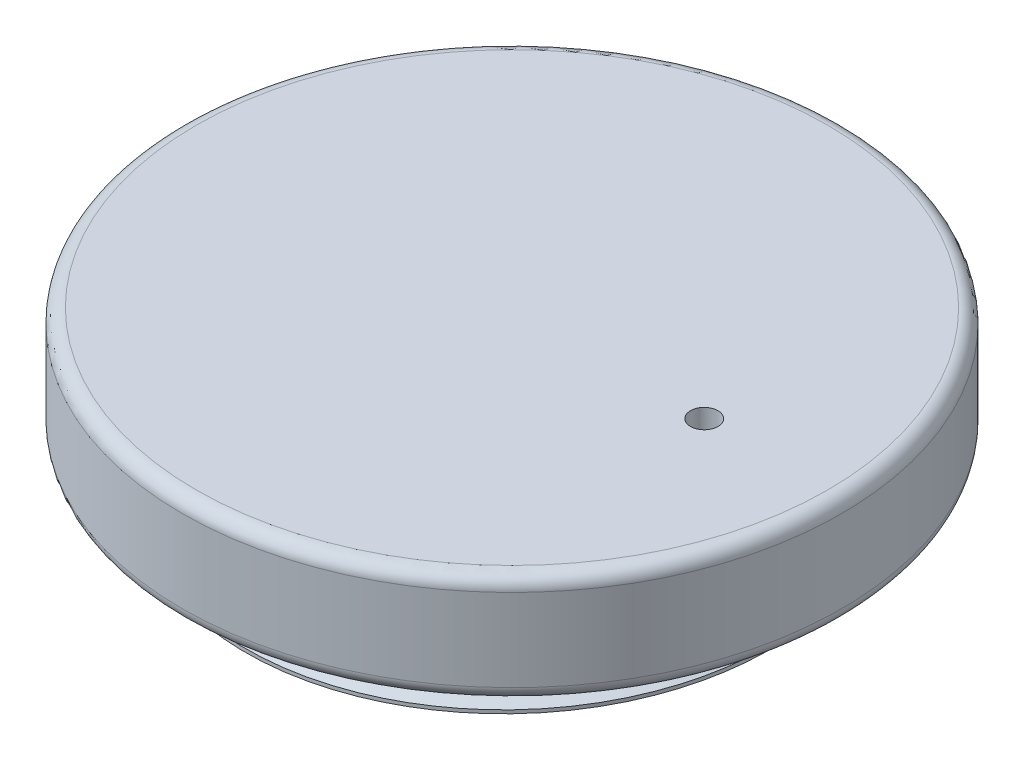
ISO-10303-21;
HEADER;
FILE_DESCRIPTION(('STEP AP214'),'2;1');
FILE_NAME('part.step','',(''),(''),'','','');
FILE_SCHEMA(('AUTOMOTIVE_DESIGN { 1 0 10303 214 1 1 1 1 }'));
ENDSEC;
DATA;
#1=APPLICATION_CONTEXT('core data for automotive mechanical design processes');
#2=APPLICATION_PROTOCOL_DEFINITION('international standard','automotive_design',2000,#1);
#3=PRODUCT_CONTEXT('',#1,'mechanical');
#4=PRODUCT('Part','Part','',(#3));
#5=PRODUCT_RELATED_PRODUCT_CATEGORY('part','',(#4));
#6=PRODUCT_DEFINITION_FORMATION('','',#4);
#7=PRODUCT_DEFINITION_CONTEXT('part definition',#1,'design');
#8=PRODUCT_DEFINITION('design','',#6,#7);
#9=PRODUCT_DEFINITION_SHAPE('','',#8);
#10=(LENGTH_UNIT() NAMED_UNIT(*) SI_UNIT(.MILLI.,.METRE.));
#11=(NAMED_UNIT(*) PLANE_ANGLE_UNIT() SI_UNIT($,.RADIAN.));
#12=(NAMED_UNIT(*) SI_UNIT($,.STERADIAN.) SOLID_ANGLE_UNIT());
#13=UNCERTAINTY_MEASURE_WITH_UNIT(LENGTH_MEASURE(1.E-05),#10,'distance_accuracy_value','');
#14=(GEOMETRIC_REPRESENTATION_CONTEXT(3) GLOBAL_UNCERTAINTY_ASSIGNED_CONTEXT((#13)) GLOBAL_UNIT_ASSIGNED_CONTEXT((#10,
#11,#12)) REPRESENTATION_CONTEXT('',''));
#15=CARTESIAN_POINT('',(0.,0.,0.));
#16=DIRECTION('',(0.,0.,1.));
#17=DIRECTION('',(1.,0.,0.));
#18=AXIS2_PLACEMENT_3D('',#15,#16,#17);
#19=CARTESIAN_POINT('',(0.,2.,0.));
#20=DIRECTION('',(0.,-1.,0.));
#21=DIRECTION('',(0.,0.,-1.));
#22=AXIS2_PLACEMENT_3D('',#19,#20,#21);
#23=CYLINDRICAL_SURFACE('',#22,9.);
#24=DIRECTION('',(0.,1.,0.));
#25=VECTOR('',#24,1.);
#26=CARTESIAN_POINT('',(-9.00000000000016,1.62500000136562,0.));
#27=LINE('',#26,#25);
#28=CARTESIAN_POINT('',(-9.00000000000016,1.25000000273118,0.));
#29=VERTEX_POINT('',#28);
#30=CARTESIAN_POINT('',(-9.00000000000016,2.00000000000006,0.));
#31=VERTEX_POINT('',#30);
#32=EDGE_CURVE('E56',#29,#31,#27,.T.);
#33=ORIENTED_EDGE('',*,*,#32,.F.);
#34=CARTESIAN_POINT('',(-9.00000000000016,1.25000000273118,0.));
#35=CARTESIAN_POINT('',(-8.99999999999968,1.18750000273121,-3.72792206135827));
#36=CARTESIAN_POINT('',(-6.36396103067892,1.12500000273125,-6.36396103067927));
#37=CARTESIAN_POINT('',(-3.72792206135761,1.06250000273119,-9.00000000000068));
#38=CARTESIAN_POINT('',(0.,1.00000000273132,-9.00000000000045));
#39=CARTESIAN_POINT('',(3.72792206135812,0.937500002731278,-8.99999999999969));
#40=CARTESIAN_POINT('',(6.36396103067889,0.875000002731108,-6.36396103067904));
#41=CARTESIAN_POINT('',(9.00000000000041,0.81250000273131,-3.72792206135881));
#42=CARTESIAN_POINT('',(8.9999999999997,0.750000002731177,-4.9960036108132E-13));
#43=CARTESIAN_POINT('',(9.00000000000014,0.687500002731282,3.72792206135791));
#44=CARTESIAN_POINT('',(6.36396103067896,0.625000002731246,6.36396103067838));
#45=CARTESIAN_POINT('',(3.72792206135795,0.562500002731133,8.99999999999981));
#46=CARTESIAN_POINT('',(0.,0.500000002731094,9.00000000000006));
#47=CARTESIAN_POINT('',(-3.72792206135755,0.437500002731105,9.00000000000035));
#48=CARTESIAN_POINT('',(-6.3639610306792,0.375000002731218,6.36396103067888));
#49=CARTESIAN_POINT('',(-8.99999999999962,0.312500002731137,3.72792206135725));
#50=CARTESIAN_POINT('',(-9.00000000000012,0.250000002731288,0.));
#51=CARTESIAN_POINT('',(-8.99999999999998,0.187500002731229,-3.72792206135803));
#52=CARTESIAN_POINT('',(-6.36396103067892,0.125000002731135,-6.36396103067927));
#53=CARTESIAN_POINT('',(-3.72792206135761,0.0625000027312004,-9.00000000000068));
#54=CARTESIAN_POINT('',(1.38777878078145E-13,2.73120415172912E-09,-9.00000000000034));
#55=CARTESIAN_POINT('',(3.72792206135798,-0.0624999972687076,-8.99999999999966));
#56=CARTESIAN_POINT('',(6.36396103067889,-0.124999997268782,-6.36396103067904));
#57=CARTESIAN_POINT('',(9.00000000000025,-0.187499997268676,-3.72792206135875));
#58=CARTESIAN_POINT('',(8.9999999999997,-0.249999997268713,-4.9960036108132E-13));
#59=CARTESIAN_POINT('',(9.00000000000014,-0.312499997268704,3.72792206135791));
#60=CARTESIAN_POINT('',(6.36396103067896,-0.374999997268866,6.36396103067838));
#61=CARTESIAN_POINT('',(3.72792206135795,-0.437499997268853,8.99999999999981));
#62=CARTESIAN_POINT('',(0.,-0.499999997268796,9.00000000000006));
#63=CARTESIAN_POINT('',(-3.7279220613575,-0.562499997268881,9.00000000000035));
#64=CARTESIAN_POINT('',(-6.36396103067913,-0.624999997268672,6.36396103067893));
#65=CARTESIAN_POINT('',(-8.99999999999959,-0.687499997268849,3.72792206135725));
#66=CARTESIAN_POINT('',(-9.00000000000009,-0.749999997268824,0.));
#67=(BOUNDED_CURVE() B_SPLINE_CURVE(2,(#34,#35,#36,#37,#38,#39,#40,#41,#42,#43,#44,#45,#46,#47,
#48,#49,#50,#51,#52,#53,#54,#55,#56,#57,#58,#59,#60,#61,#62,#63,#64,#65,#66),.UNSPECIFIED.,.F.,
.F.) B_SPLINE_CURVE_WITH_KNOTS((3,2,2,2,2,2,2,2,2,2,2,2,2,2,2,2,3),(0.,0.0625,0.125,0.1875,0.25,
0.3125,0.375,0.4375,0.5,0.5625,0.625,0.6875,0.75,0.8125,0.875,0.9375,1.),
.UNSPECIFIED.) CURVE() GEOMETRIC_REPRESENTATION_ITEM() RATIONAL_B_SPLINE_CURVE((1.,
0.923879532511287,1.,0.923879532511287,1.,0.923879532511287,1.,0.923879532511287,1.,
0.923879532511287,1.,0.923879532511287,1.,0.923879532511287,1.,0.923879532511287,1.,
0.923879532511287,1.,0.923879532511287,1.,0.923879532511287,1.,0.923879532511287,1.,
0.923879532511287,1.,0.923879532511287,1.,0.923879532511287,1.,0.923879532511287,1.)) REPRESENTATION_ITEM(''));
#68=CARTESIAN_POINT('',(1.62906341194535E-07,0.,-9.00000000000017));
#69=VERTEX_POINT('',#68);
#70=EDGE_CURVE('E61',#29,#69,#67,.T.);
#71=ORIENTED_EDGE('',*,*,#70,.T.);
#72=CARTESIAN_POINT('',(0.,0.,0.));
#73=DIRECTION('',(0.,1.,0.));
#74=DIRECTION('',(0.,0.,1.));
#75=AXIS2_PLACEMENT_3D('',#72,#73,#74);
#76=CIRCLE('',#75,9.);
#77=CARTESIAN_POINT('',(-9.00000000000012,0.,0.));
#78=VERTEX_POINT('',#77);
#79=EDGE_CURVE('E125',#69,#78,#76,.T.);
#80=ORIENTED_EDGE('',*,*,#79,.T.);
#81=CARTESIAN_POINT('',(-9.00000000000016,2.00000000000006,0.));
#82=CARTESIAN_POINT('',(-8.99999999999968,1.93750000000005,-3.72792206135827));
#83=CARTESIAN_POINT('',(-6.36396103067892,1.87500000000013,-6.36396103067927));
#84=CARTESIAN_POINT('',(-3.72792206135761,1.81250000000002,-9.00000000000068));
#85=CARTESIAN_POINT('',(0.,1.74999999999997,-9.00000000000045));
#86=CARTESIAN_POINT('',(3.72792206135797,1.68750000000011,-8.99999999999969));
#87=CARTESIAN_POINT('',(6.36396103067889,1.62499999999999,-6.36396103067904));
#88=CARTESIAN_POINT('',(9.00000000000041,1.56250000000014,-3.72792206135881));
#89=CARTESIAN_POINT('',(8.9999999999997,1.50000000000006,-4.9960036108132E-13));
#90=CARTESIAN_POINT('',(9.00000000000014,1.43750000000011,3.72792206135797));
#91=CARTESIAN_POINT('',(6.36396103067892,1.3749999999999,6.36396103067838));
#92=CARTESIAN_POINT('',(3.72792206135839,1.31249999999997,8.99999999999963));
#93=CARTESIAN_POINT('',(0.,1.24999999999997,9.00000000000006));
#94=CARTESIAN_POINT('',(-3.72792206135755,1.18749999999994,9.00000000000035));
#95=CARTESIAN_POINT('',(-6.3639610306792,1.1250000000001,6.36396103067888));
#96=CARTESIAN_POINT('',(-8.99999999999959,1.06249999999997,3.72792206135725));
#97=CARTESIAN_POINT('',(-9.00000000000016,0.999999999999945,0.));
#98=CARTESIAN_POINT('',(-8.99999999999968,0.937500000000062,-3.72792206135827));
#99=CARTESIAN_POINT('',(-6.36396103067892,0.875000000000015,-6.36396103067927));
#100=CARTESIAN_POINT('',(-3.72792206135761,0.812500000000034,-9.00000000000068));
#101=CARTESIAN_POINT('',(0.,0.750000000000084,-9.00000000000045));
#102=CARTESIAN_POINT('',(3.72792206135786,0.687500000000125,-8.99999999999972));
#103=CARTESIAN_POINT('',(6.36396103067889,0.625000000000098,-6.36396103067904));
#104=CARTESIAN_POINT('',(9.00000000000025,0.562500000000157,-3.72792206135875));
#105=CARTESIAN_POINT('',(8.9999999999997,0.499999999999945,-4.9960036108132E-13));
#106=CARTESIAN_POINT('',(9.00000000000014,0.437499999999889,3.72792206135791));
#107=CARTESIAN_POINT('',(6.36396103067896,0.375000000000014,6.36396103067838));
#108=CARTESIAN_POINT('',(3.72792206135795,0.312499999999981,8.99999999999981));
#109=CARTESIAN_POINT('',(0.,0.250000000000083,9.00000000000006));
#110=CARTESIAN_POINT('',(-3.72792206135755,0.187499999999952,9.00000000000035));
#111=CARTESIAN_POINT('',(-6.3639610306792,0.124999999999986,6.36396103067888));
#112=CARTESIAN_POINT('',(-8.99999999999959,0.0624999999999841,3.72792206135725));
#113=CARTESIAN_POINT('',(-9.00000000000012,0.,0.));
#114=(BOUNDED_CURVE() B_SPLINE_CURVE(2,(#81,#82,#83,#84,#85,#86,#87,#88,#89,#90,#91,#92,#93,#94,
#95,#96,#97,#98,#99,#100,#101,#102,#103,#104,#105,#106,#107,#108,#109,#110,#111,#112,#113),
.UNSPECIFIED.,.F.,.F.) B_SPLINE_CURVE_WITH_KNOTS((3,2,2,2,2,2,2,2,2,2,2,2,2,2,2,2,3),(0.,0.0625,
0.125,0.1875,0.25,0.3125,0.375,0.4375,0.5,0.5625,0.625,0.6875,0.75,0.8125,0.875,0.9375,1.),
.UNSPECIFIED.) CURVE() GEOMETRIC_REPRESENTATION_ITEM() RATIONAL_B_SPLINE_CURVE((1.,
0.923879532511287,1.,0.923879532511287,1.,0.923879532511287,1.,0.923879532511287,1.,
0.923879532511287,1.,0.923879532511287,1.,0.923879532511287,1.,0.923879532511287,1.,
0.923879532511287,1.,0.923879532511287,1.,0.923879532511287,1.,0.923879532511287,1.,
0.923879532511287,1.,0.923879532511287,1.,0.923879532511287,1.,0.923879532511287,1.)) REPRESENTATION_ITEM(''));
#115=EDGE_CURVE('E110',#31,#78,#114,.T.);
#116=ORIENTED_EDGE('',*,*,#115,.F.);
#117=CARTESIAN_POINT('',(0.,2.,0.));
#118=DIRECTION('',(0.,1.,0.));
#119=DIRECTION('',(0.,0.,1.));
#120=AXIS2_PLACEMENT_3D('',#117,#118,#119);
#121=CIRCLE('',#120,9.);
#122=EDGE_CURVE('E121',#31,#31,#121,.T.);
#123=ORIENTED_EDGE('',*,*,#122,.F.);
#124=EDGE_LOOP('',(#33,#71,#80,#116,#123));
#125=FACE_BOUND('',#124,.T.);
#126=ADVANCED_FACE('F41',(#125),#23,.T.);
#127=CARTESIAN_POINT('',(0.,0.,0.));
#128=DIRECTION('',(0.,1.,0.));
#129=DIRECTION('',(0.,0.,1.));
#130=AXIS2_PLACEMENT_3D('',#127,#128,#129);
#131=PLANE('',#130);
#132=CARTESIAN_POINT('',(7.00000000000009,0.,-2.77555756156289E-13));
#133=DIRECTION('',(0.,1.,0.));
#134=DIRECTION('',(0.,0.,1.));
#135=AXIS2_PLACEMENT_3D('',#132,#133,#134);
#136=CIRCLE('',#135,0.500000000000001);
#137=CARTESIAN_POINT('',(7.00000000000009,0.,0.499999999999724));
#138=VERTEX_POINT('',#137);
#139=EDGE_CURVE('E120',#138,#138,#136,.T.);
#140=ORIENTED_EDGE('',*,*,#139,.T.);
#141=EDGE_LOOP('',(#140));
#142=FACE_BOUND('',#141,.T.);
#143=ORIENTED_EDGE('',*,*,#79,.F.);
#144=EDGE_CURVE('E93',#78,#69,#76,.T.);
#145=ORIENTED_EDGE('',*,*,#144,.F.);
#146=EDGE_LOOP('',(#143,#145));
#147=FACE_BOUND('',#146,.T.);
#148=ADVANCED_FACE('F155',(#142,#147),#131,.F.);
#149=CARTESIAN_POINT('',(1.38777878078145E-13,6.00000000000001,-2.22044604925031E-13));
#150=DIRECTION('',(0.,-1.,0.));
#151=DIRECTION('',(0.,0.,-1.));
#152=AXIS2_PLACEMENT_3D('',#149,#150,#151);
#153=CYLINDRICAL_SURFACE('',#152,12.);
#154=CARTESIAN_POINT('',(1.38777878078145E-13,5.50000000000006,-2.22044604925031E-13));
#155=DIRECTION('',(0.,1.,0.));
#156=DIRECTION('',(0.,0.,1.));
#157=AXIS2_PLACEMENT_3D('',#154,#155,#156);
#158=CIRCLE('',#157,12.);
#159=CARTESIAN_POINT('',(1.38111744263369E-13,5.50000000000006,11.9999999999998));
#160=VERTEX_POINT('',#159);
#161=EDGE_CURVE('E49',#160,#160,#158,.F.);
#162=ORIENTED_EDGE('',*,*,#161,.T.);
#163=EDGE_LOOP('',(#162));
#164=FACE_BOUND('',#163,.T.);
#165=CARTESIAN_POINT('',(0.,2.49999999999995,0.));
#166=DIRECTION('',(0.,1.,0.));
#167=DIRECTION('',(0.,0.,1.));
#168=AXIS2_PLACEMENT_3D('',#165,#166,#167);
#169=CIRCLE('',#168,12.);
#170=CARTESIAN_POINT('',(0.,2.49999999999995,12.));
#171=VERTEX_POINT('',#170);
#172=EDGE_CURVE('E129',#171,#171,#169,.T.);
#173=ORIENTED_EDGE('',*,*,#172,.T.);
#174=EDGE_LOOP('',(#173));
#175=FACE_BOUND('',#174,.T.);
#176=ADVANCED_FACE('F134',(#164,#175),#153,.T.);
#177=CARTESIAN_POINT('',(1.38777878078145E-13,6.00000000000001,-2.22044604925031E-13));
#178=DIRECTION('',(0.,1.,0.));
#179=DIRECTION('',(0.,0.,1.));
#180=AXIS2_PLACEMENT_3D('',#177,#178,#179);
#181=PLANE('',#180);
#182=CARTESIAN_POINT('',(7.00000000000012,6.00000000000006,-3.33066907387547E-13));
#183=DIRECTION('',(0.,1.,0.));
#184=DIRECTION('',(0.,0.,1.));
#185=AXIS2_PLACEMENT_3D('',#182,#183,#184);
#186=CIRCLE('',#185,0.500000000000001);
#187=CARTESIAN_POINT('',(7.00000000000012,6.00000000000006,0.499999999999668));
#188=VERTEX_POINT('',#187);
#189=EDGE_CURVE('E264',#188,#188,#186,.T.);
#190=ORIENTED_EDGE('',*,*,#189,.F.);
#191=EDGE_LOOP('',(#190));
#192=FACE_BOUND('',#191,.T.);
#193=CARTESIAN_POINT('',(1.38777878078145E-13,6.00000000000001,-2.22044604925031E-13));
#194=DIRECTION('',(0.,1.,0.));
#195=DIRECTION('',(0.,0.,1.));
#196=AXIS2_PLACEMENT_3D('',#193,#194,#195);
#197=CIRCLE('',#196,11.5);
#198=CARTESIAN_POINT('',(1.38139499838985E-13,6.00000000000001,11.4999999999998));
#199=VERTEX_POINT('',#198);
#200=EDGE_CURVE('E124',#199,#199,#197,.T.);
#201=ORIENTED_EDGE('',*,*,#200,.T.);
#202=EDGE_LOOP('',(#201));
#203=FACE_BOUND('',#202,.T.);
#204=ADVANCED_FACE('F142',(#192,#203),#181,.T.);
#205=CARTESIAN_POINT('',(0.,2.,0.));
#206=DIRECTION('',(0.,1.,0.));
#207=DIRECTION('',(0.,0.,1.));
#208=AXIS2_PLACEMENT_3D('',#205,#206,#207);
#209=PLANE('',#208);
#210=CARTESIAN_POINT('',(0.,2.,0.));
#211=DIRECTION('',(0.,1.,0.));
#212=DIRECTION('',(0.,0.,1.));
#213=AXIS2_PLACEMENT_3D('',#210,#211,#212);
#214=CIRCLE('',#213,11.5);
#215=CARTESIAN_POINT('',(0.,2.,11.5));
#216=VERTEX_POINT('',#215);
#217=EDGE_CURVE('E11',#216,#216,#214,.F.);
#218=ORIENTED_EDGE('',*,*,#217,.T.);
#219=EDGE_LOOP('',(#218));
#220=FACE_BOUND('',#219,.T.);
#221=ORIENTED_EDGE('',*,*,#122,.T.);
#222=EDGE_LOOP('',(#221));
#223=FACE_BOUND('',#222,.T.);
#224=ADVANCED_FACE('F144',(#220,#223),#209,.F.);
#225=CARTESIAN_POINT('',(-9.54126587500007,1.62500000136562,0.));
#226=DIRECTION('',(0.,0.,1.));
#227=DIRECTION('',(1.,0.,0.));
#228=AXIS2_PLACEMENT_3D('',#225,#226,#227);
#229=PLANE('',#228);
#230=DIRECTION('',(0.,-1.,0.));
#231=VECTOR('',#230,1.);
#232=CARTESIAN_POINT('',(-9.54126587500007,1.62500000136562,0.));
#233=LINE('',#232,#231);
#234=CARTESIAN_POINT('',(-9.54126587500007,1.68750000136569,0.));
#235=VERTEX_POINT('',#234);
#236=CARTESIAN_POINT('',(-9.54126587500007,1.56250000136554,0.));
#237=VERTEX_POINT('',#236);
#238=EDGE_CURVE('E181',#235,#237,#233,.T.);
#239=ORIENTED_EDGE('',*,*,#238,.T.);
#240=DIRECTION('',(0.866025403784443,-0.499999999999998,0.));
#241=VECTOR('',#240,1.);
#242=CARTESIAN_POINT('',(-9.27063293750005,1.40625000204847,-2.77555756156289E-13));
#243=LINE('',#242,#241);
#244=EDGE_CURVE('E104',#237,#29,#243,.T.);
#245=ORIENTED_EDGE('',*,*,#244,.T.);
#246=ORIENTED_EDGE('',*,*,#32,.T.);
#247=DIRECTION('',(-0.866025403784443,-0.499999999999998,0.));
#248=VECTOR('',#247,1.);
#249=CARTESIAN_POINT('',(-9.27063293750005,1.84375000068276,-2.77555756156289E-13));
#250=LINE('',#249,#248);
#251=EDGE_CURVE('E109',#31,#235,#250,.T.);
#252=ORIENTED_EDGE('',*,*,#251,.T.);
#253=EDGE_LOOP('',(#239,#245,#246,#252));
#254=FACE_BOUND('',#253,.T.);
#255=ADVANCED_FACE('F152',(#254),#229,.T.);
#256=CARTESIAN_POINT('',(-9.54126587500004,-0.374999998634384,0.));
#257=DIRECTION('',(0.,0.,-1.));
#258=DIRECTION('',(-1.,0.,0.));
#259=AXIS2_PLACEMENT_3D('',#256,#257,#258);
#260=PLANE('',#259);
#261=DIRECTION('',(0.,1.,0.));
#262=VECTOR('',#261,1.);
#263=CARTESIAN_POINT('',(-9.54126587500004,-0.374999998634384,0.));
#264=LINE('',#263,#262);
#265=CARTESIAN_POINT('',(-9.54126587500004,-0.437499998634461,0.));
#266=VERTEX_POINT('',#265);
#267=CARTESIAN_POINT('',(-9.54126587500004,-0.312499998634308,0.));
#268=VERTEX_POINT('',#267);
#269=EDGE_CURVE('E207',#266,#268,#264,.T.);
#270=ORIENTED_EDGE('',*,*,#269,.T.);
#271=DIRECTION('',(0.866025403784443,0.499999999999998,0.));
#272=VECTOR('',#271,1.);
#273=CARTESIAN_POINT('',(-9.27063293750008,-0.156249999317237,0.));
#274=LINE('',#273,#272);
#275=EDGE_CURVE('E108',#268,#78,#274,.T.);
#276=ORIENTED_EDGE('',*,*,#275,.T.);
#277=DIRECTION('',(0.,-1.,0.));
#278=VECTOR('',#277,1.);
#279=CARTESIAN_POINT('',(-9.00000000000009,-0.374999998634384,0.));
#280=LINE('',#279,#278);
#281=CARTESIAN_POINT('',(-9.00000000000009,-0.749999997268824,0.));
#282=VERTEX_POINT('',#281);
#283=EDGE_CURVE('E90',#78,#282,#280,.T.);
#284=ORIENTED_EDGE('',*,*,#283,.T.);
#285=DIRECTION('',(-0.866025403784443,0.499999999999998,0.));
#286=VECTOR('',#285,1.);
#287=CARTESIAN_POINT('',(-9.27063293750008,-0.593749997951531,0.));
#288=LINE('',#287,#286);
#289=EDGE_CURVE('E95',#282,#266,#288,.T.);
#290=ORIENTED_EDGE('',*,*,#289,.T.);
#291=EDGE_LOOP('',(#270,#276,#284,#290));
#292=FACE_BOUND('',#291,.T.);
#293=ADVANCED_FACE('F106',(#292),#260,.T.);
#294=CARTESIAN_POINT('',(-9.54126587500007,1.68750000136569,0.));
#295=CARTESIAN_POINT('',(-9.54126587499938,1.62500000136574,-3.95212172763296));
#296=CARTESIAN_POINT('',(-6.74669380131621,1.56250000136554,-6.74669380131687));
#297=CARTESIAN_POINT('',(-3.95212172763223,1.50000000136571,-9.54126587500019));
#298=CARTESIAN_POINT('',(0.,1.43750000136561,-9.54126587499993));
#299=CARTESIAN_POINT('',(3.9521217276332,1.37500000136556,-9.54126587500067));
#300=CARTESIAN_POINT('',(6.74669380131646,1.31250000136562,-6.74669380131665));
#301=CARTESIAN_POINT('',(9.5412658750008,1.25000000136559,-3.95212172763272));
#302=CARTESIAN_POINT('',(9.54126587500008,1.18750000136569,-1.11022302462516E-13));
#303=CARTESIAN_POINT('',(9.54126587500012,1.12500000136556,3.95212172763266));
#304=CARTESIAN_POINT('',(6.74669380131654,1.06250000136554,6.74669380131582));
#305=CARTESIAN_POINT('',(3.95212172763257,1.00000000136565,9.54126587500007));
#306=CARTESIAN_POINT('',(0.,0.93750000136561,9.54126587499998));
#307=CARTESIAN_POINT('',(-3.95212172763223,0.875000001365626,9.54126587499916));
#308=CARTESIAN_POINT('',(-6.74669380131616,0.812500001365735,6.7466938013156));
#309=CARTESIAN_POINT('',(-9.541265875,0.750000001365658,3.95212172763266));
#310=CARTESIAN_POINT('',(-9.54126587500004,0.687500001365582,0.));
#311=CARTESIAN_POINT('',(-9.54126587499951,0.62500000136575,-3.95212172763323));
#312=CARTESIAN_POINT('',(-6.74669380131621,0.562500001365651,-6.74669380131687));
#313=CARTESIAN_POINT('',(-3.95212172763259,0.500000001365481,-9.54126587500019));
#314=CARTESIAN_POINT('',(0.,0.43750000136572,-9.54126587499993));
#315=CARTESIAN_POINT('',(3.95212172763304,0.375000001365573,-9.54126587500073));
#316=CARTESIAN_POINT('',(6.74669380131646,0.312500001365512,-6.74669380131665));
#317=CARTESIAN_POINT('',(9.54126587500061,0.250000001365605,-3.95212172763272));
#318=CARTESIAN_POINT('',(9.54126587500008,0.187500001365581,-1.11022302462516E-13));
#319=CARTESIAN_POINT('',(9.54126587500005,0.125000001365576,3.95212172763266));
#320=CARTESIAN_POINT('',(6.74669380131654,0.0625000013656507,6.74669380131582));
#321=CARTESIAN_POINT('',(3.95212172763257,1.36566826294514E-09,9.54126587500007));
#322=CARTESIAN_POINT('',(0.,-0.0624999986345021,9.54126587499998));
#323=CARTESIAN_POINT('',(-3.95212172763227,-0.12499999863436,9.54126587499922));
#324=CARTESIAN_POINT('',(-6.74669380131616,-0.187499998634377,6.7466938013156));
#325=CARTESIAN_POINT('',(-9.54126587500004,-0.249999998634328,3.95212172763266));
#326=CARTESIAN_POINT('',(-9.54126587500004,-0.312499998634308,0.));
#327=CARTESIAN_POINT('',(-9.54126587500007,1.56250000136554,0.));
#328=CARTESIAN_POINT('',(-9.54126587499938,1.50000000136577,-3.95212172763296));
#329=CARTESIAN_POINT('',(-6.74669380131621,1.43750000136561,-6.74669380131687));
#330=CARTESIAN_POINT('',(-3.95212172763223,1.3750000013655,-9.54126587500019));
#331=CARTESIAN_POINT('',(0.,1.31250000136568,-9.54126587499993));
#332=CARTESIAN_POINT('',(3.9521217276332,1.25000000136559,-9.54126587500067));
#333=CARTESIAN_POINT('',(6.74669380131646,1.18750000136569,-6.74669380131665));
#334=CARTESIAN_POINT('',(9.5412658750008,1.12500000136562,-3.95212172763272));
#335=CARTESIAN_POINT('',(9.54126587500008,1.06250000136554,-1.11022302462516E-13));
#336=CARTESIAN_POINT('',(9.54126587500012,1.00000000136559,3.95212172763266));
#337=CARTESIAN_POINT('',(6.74669380131654,0.93750000136561,6.74669380131582));
#338=CARTESIAN_POINT('',(3.95212172763257,0.875000001365686,9.54126587500007));
#339=CARTESIAN_POINT('',(0.,0.812500001365679,9.54126587499998));
#340=CARTESIAN_POINT('',(-3.95212172763223,0.750000001365658,9.54126587499916));
#341=CARTESIAN_POINT('',(-6.74669380131616,0.687500001365582,6.7466938013156));
#342=CARTESIAN_POINT('',(-9.54126587500004,0.625000001365689,3.95212172763266));
#343=CARTESIAN_POINT('',(-9.54126587500004,0.562500001365651,0.));
#344=CARTESIAN_POINT('',(-9.54126587499951,0.500000001365541,-3.95212172763323));
#345=CARTESIAN_POINT('',(-6.74669380131621,0.43750000136572,-6.74669380131687));
#346=CARTESIAN_POINT('',(-3.95212172763259,0.375000001365513,-9.54126587500019));
#347=CARTESIAN_POINT('',(0.,0.312500001365568,-9.54126587499993));
#348=CARTESIAN_POINT('',(3.95212172763304,0.250000001365605,-9.54126587500073));
#349=CARTESIAN_POINT('',(6.74669380131646,0.187500001365581,-6.74669380131665));
#350=CARTESIAN_POINT('',(9.54126587500061,0.125000001365636,-3.95212172763272));
#351=CARTESIAN_POINT('',(9.54126587500008,0.0625000013656507,-1.11022302462516E-13));
#352=CARTESIAN_POINT('',(9.54126587500005,1.36560817810802E-09,3.95212172763266));
#353=CARTESIAN_POINT('',(6.74669380131654,-0.0624999986345021,6.74669380131582));
#354=CARTESIAN_POINT('',(3.95212172763257,-0.1249999986343,9.54126587500007));
#355=CARTESIAN_POINT('',(0.,-0.187499998634433,9.54126587499998));
#356=CARTESIAN_POINT('',(-3.95212172763227,-0.249999998634328,9.54126587499922));
#357=CARTESIAN_POINT('',(-6.74669380131616,-0.312499998634308,6.7466938013156));
#358=CARTESIAN_POINT('',(-9.54126587500004,-0.374999998634296,3.95212172763266));
#359=CARTESIAN_POINT('',(-9.54126587500004,-0.437499998634461,0.));
#360=(BOUNDED_SURFACE() B_SPLINE_SURFACE(1,2,((#294,#295,#296,#297,#298,#299,#300,#301,#302,
#303,#304,#305,#306,#307,#308,#309,#310,#311,#312,#313,#314,#315,#316,#317,#318,#319,#320,#321,
#322,#323,#324,#325,#326),(#327,#328,#329,#330,#331,#332,#333,#334,#335,#336,#337,#338,#339,
#340,#341,#342,#343,#344,#345,#346,#347,#348,#349,#350,#351,#352,#353,#354,#355,#356,#357,#358,
#359)),.UNSPECIFIED.,.F.,.F.,.F.) B_SPLINE_SURFACE_WITH_KNOTS((2,2),(3,2,2,2,2,2,2,2,2,2,2,2,2,
2,2,2,3),(0.,1.),(0.,0.0625,0.125,0.1875,0.25,0.3125,0.375,0.4375,0.5,0.5625,0.625,0.6875,0.75,
0.8125,0.875,0.9375,1.),
.UNSPECIFIED.) GEOMETRIC_REPRESENTATION_ITEM() RATIONAL_B_SPLINE_SURFACE(((1.,0.923879532511287,
1.,0.923879532511287,1.,0.923879532511287,1.,0.923879532511287,1.,0.923879532511287,1.,
0.923879532511287,1.,0.923879532511287,1.,0.923879532511287,1.,0.923879532511287,1.,
0.923879532511287,1.,0.923879532511287,1.,0.923879532511287,1.,0.923879532511287,1.,
0.923879532511287,1.,0.923879532511287,1.,0.923879532511287,1.),(1.,0.923879532511287,1.,
0.923879532511287,1.,0.923879532511287,1.,0.923879532511287,1.,0.923879532511287,1.,
0.923879532511287,1.,0.923879532511287,1.,0.923879532511287,1.,0.923879532511287,1.,
0.923879532511287,1.,0.923879532511287,1.,0.923879532511287,1.,0.923879532511287,1.,
0.923879532511287,1.,0.923879532511287,1.,0.923879532511287,1.))) REPRESENTATION_ITEM('') SURFACE());
#361=CARTESIAN_POINT('',(-9.54126587500007,1.68750000136569,0.));
#362=CARTESIAN_POINT('',(-9.54126587499938,1.62500000136574,-3.95212172763296));
#363=CARTESIAN_POINT('',(-6.74669380131621,1.56250000136554,-6.74669380131687));
#364=CARTESIAN_POINT('',(-3.95212172763223,1.50000000136571,-9.54126587500019));
#365=CARTESIAN_POINT('',(0.,1.43750000136561,-9.54126587499993));
#366=CARTESIAN_POINT('',(3.9521217276332,1.37500000136556,-9.54126587500067));
#367=CARTESIAN_POINT('',(6.74669380131646,1.31250000136562,-6.74669380131665));
#368=CARTESIAN_POINT('',(9.5412658750008,1.25000000136559,-3.95212172763272));
#369=CARTESIAN_POINT('',(9.54126587500008,1.18750000136569,-1.11022302462516E-13));
#370=CARTESIAN_POINT('',(9.54126587500012,1.12500000136556,3.95212172763266));
#371=CARTESIAN_POINT('',(6.74669380131654,1.06250000136554,6.74669380131582));
#372=CARTESIAN_POINT('',(3.95212172763257,1.00000000136565,9.54126587500007));
#373=CARTESIAN_POINT('',(0.,0.93750000136561,9.54126587499998));
#374=CARTESIAN_POINT('',(-3.95212172763223,0.875000001365626,9.54126587499916));
#375=CARTESIAN_POINT('',(-6.74669380131616,0.812500001365735,6.7466938013156));
#376=CARTESIAN_POINT('',(-9.541265875,0.750000001365658,3.95212172763266));
#377=CARTESIAN_POINT('',(-9.54126587500004,0.687500001365582,0.));
#378=CARTESIAN_POINT('',(-9.54126587499951,0.62500000136575,-3.95212172763323));
#379=CARTESIAN_POINT('',(-6.74669380131621,0.562500001365651,-6.74669380131687));
#380=CARTESIAN_POINT('',(-3.95212172763259,0.500000001365481,-9.54126587500019));
#381=CARTESIAN_POINT('',(0.,0.43750000136572,-9.54126587499993));
#382=CARTESIAN_POINT('',(3.95212172763304,0.375000001365573,-9.54126587500073));
#383=CARTESIAN_POINT('',(6.74669380131646,0.312500001365512,-6.74669380131665));
#384=CARTESIAN_POINT('',(9.54126587500061,0.250000001365605,-3.95212172763272));
#385=CARTESIAN_POINT('',(9.54126587500008,0.187500001365581,-1.11022302462516E-13));
#386=CARTESIAN_POINT('',(9.54126587500005,0.125000001365576,3.95212172763266));
#387=CARTESIAN_POINT('',(6.74669380131654,0.0625000013656507,6.74669380131582));
#388=CARTESIAN_POINT('',(3.95212172763257,1.36566826294514E-09,9.54126587500007));
#389=CARTESIAN_POINT('',(0.,-0.0624999986345021,9.54126587499998));
#390=CARTESIAN_POINT('',(-3.95212172763227,-0.12499999863436,9.54126587499922));
#391=CARTESIAN_POINT('',(-6.74669380131616,-0.187499998634377,6.7466938013156));
#392=CARTESIAN_POINT('',(-9.54126587500004,-0.249999998634328,3.95212172763266));
#393=CARTESIAN_POINT('',(-9.54126587500004,-0.312499998634308,0.));
#394=(BOUNDED_CURVE() B_SPLINE_CURVE(2,(#361,#362,#363,#364,#365,#366,#367,#368,#369,#370,#371,
#372,#373,#374,#375,#376,#377,#378,#379,#380,#381,#382,#383,#384,#385,#386,#387,#388,#389,#390,
#391,#392,#393),.UNSPECIFIED.,.F.,.F.) B_SPLINE_CURVE_WITH_KNOTS((3,2,2,2,2,2,2,2,2,2,2,2,2,2,2,
2,3),(0.,0.0625,0.125,0.1875,0.25,0.3125,0.375,0.4375,0.5,0.5625,0.625,0.6875,0.75,0.8125,0.875,
0.9375,1.),.UNSPECIFIED.) CURVE() GEOMETRIC_REPRESENTATION_ITEM() RATIONAL_B_SPLINE_CURVE((1.,
0.923879532511287,1.,0.923879532511287,1.,0.923879532511287,1.,0.923879532511287,1.,
0.923879532511287,1.,0.923879532511287,1.,0.923879532511287,1.,0.923879532511287,1.,
0.923879532511287,1.,0.923879532511287,1.,0.923879532511287,1.,0.923879532511287,1.,
0.923879532511287,1.,0.923879532511287,1.,0.923879532511287,1.,0.923879532511287,1.)) REPRESENTATION_ITEM(''));
#395=EDGE_CURVE('E112',#235,#268,#394,.T.);
#396=CARTESIAN_POINT('',(-9.54126587500007,1.56250000136554,0.));
#397=CARTESIAN_POINT('',(-9.54126587499938,1.50000000136577,-3.95212172763296));
#398=CARTESIAN_POINT('',(-6.74669380131621,1.43750000136561,-6.74669380131687));
#399=CARTESIAN_POINT('',(-3.95212172763223,1.3750000013655,-9.54126587500019));
#400=CARTESIAN_POINT('',(0.,1.31250000136568,-9.54126587499993));
#401=CARTESIAN_POINT('',(3.9521217276332,1.25000000136559,-9.54126587500067));
#402=CARTESIAN_POINT('',(6.74669380131646,1.18750000136569,-6.74669380131665));
#403=CARTESIAN_POINT('',(9.5412658750008,1.12500000136562,-3.95212172763272));
#404=CARTESIAN_POINT('',(9.54126587500008,1.06250000136554,-1.11022302462516E-13));
#405=CARTESIAN_POINT('',(9.54126587500012,1.00000000136559,3.95212172763266));
#406=CARTESIAN_POINT('',(6.74669380131654,0.93750000136561,6.74669380131582));
#407=CARTESIAN_POINT('',(3.95212172763257,0.875000001365686,9.54126587500007));
#408=CARTESIAN_POINT('',(0.,0.812500001365679,9.54126587499998));
#409=CARTESIAN_POINT('',(-3.95212172763223,0.750000001365658,9.54126587499916));
#410=CARTESIAN_POINT('',(-6.74669380131616,0.687500001365582,6.7466938013156));
#411=CARTESIAN_POINT('',(-9.54126587500004,0.625000001365689,3.95212172763266));
#412=CARTESIAN_POINT('',(-9.54126587500004,0.562500001365651,0.));
#413=CARTESIAN_POINT('',(-9.54126587499951,0.500000001365541,-3.95212172763323));
#414=CARTESIAN_POINT('',(-6.74669380131621,0.43750000136572,-6.74669380131687));
#415=CARTESIAN_POINT('',(-3.95212172763259,0.375000001365513,-9.54126587500019));
#416=CARTESIAN_POINT('',(0.,0.312500001365568,-9.54126587499993));
#417=CARTESIAN_POINT('',(3.95212172763304,0.250000001365605,-9.54126587500073));
#418=CARTESIAN_POINT('',(6.74669380131646,0.187500001365581,-6.74669380131665));
#419=CARTESIAN_POINT('',(9.54126587500061,0.125000001365636,-3.95212172763272));
#420=CARTESIAN_POINT('',(9.54126587500008,0.0625000013656507,-1.11022302462516E-13));
#421=CARTESIAN_POINT('',(9.54126587500005,1.36560817810802E-09,3.95212172763266));
#422=CARTESIAN_POINT('',(6.74669380131654,-0.0624999986345021,6.74669380131582));
#423=CARTESIAN_POINT('',(3.95212172763257,-0.1249999986343,9.54126587500007));
#424=CARTESIAN_POINT('',(0.,-0.187499998634433,9.54126587499998));
#425=CARTESIAN_POINT('',(-3.95212172763227,-0.249999998634328,9.54126587499922));
#426=CARTESIAN_POINT('',(-6.74669380131616,-0.312499998634308,6.7466938013156));
#427=CARTESIAN_POINT('',(-9.54126587500004,-0.374999998634296,3.95212172763266));
#428=CARTESIAN_POINT('',(-9.54126587500004,-0.437499998634461,0.));
#429=(BOUNDED_CURVE() B_SPLINE_CURVE(2,(#396,#397,#398,#399,#400,#401,#402,#403,#404,#405,#406,
#407,#408,#409,#410,#411,#412,#413,#414,#415,#416,#417,#418,#419,#420,#421,#422,#423,#424,#425,
#426,#427,#428),.UNSPECIFIED.,.F.,.F.) B_SPLINE_CURVE_WITH_KNOTS((3,2,2,2,2,2,2,2,2,2,2,2,2,2,2,
2,3),(0.,0.0625,0.125,0.1875,0.25,0.3125,0.375,0.4375,0.5,0.5625,0.625,0.6875,0.75,0.8125,0.875,
0.9375,1.),.UNSPECIFIED.) CURVE() GEOMETRIC_REPRESENTATION_ITEM() RATIONAL_B_SPLINE_CURVE((1.,
0.923879532511287,1.,0.923879532511287,1.,0.923879532511287,1.,0.923879532511287,1.,
0.923879532511287,1.,0.923879532511287,1.,0.923879532511287,1.,0.923879532511287,1.,
0.923879532511287,1.,0.923879532511287,1.,0.923879532511287,1.,0.923879532511287,1.,
0.923879532511287,1.,0.923879532511287,1.,0.923879532511287,1.,0.923879532511287,1.)) REPRESENTATION_ITEM(''));
#430=EDGE_CURVE('E100',#237,#266,#429,.T.);
#431=ORIENTED_EDGE('',*,*,#238,.F.);
#432=ORIENTED_EDGE('',*,*,#395,.T.);
#433=ORIENTED_EDGE('',*,*,#269,.F.);
#434=ORIENTED_EDGE('',*,*,#430,.F.);
#435=EDGE_LOOP('',(#431,#432,#433,#434));
#436=FACE_BOUND('',#435,.T.);
#437=ADVANCED_FACE('F214',(#436),#360,.F.);
#438=CARTESIAN_POINT('',(-9.00000000000016,2.00000000000006,0.));
#439=CARTESIAN_POINT('',(-8.99999999999968,1.93750000000005,-3.72792206135827));
#440=CARTESIAN_POINT('',(-6.36396103067892,1.87500000000013,-6.36396103067927));
#441=CARTESIAN_POINT('',(-3.72792206135761,1.81250000000002,-9.00000000000068));
#442=CARTESIAN_POINT('',(0.,1.74999999999997,-9.00000000000045));
#443=CARTESIAN_POINT('',(3.72792206135797,1.68750000000011,-8.99999999999969));
#444=CARTESIAN_POINT('',(6.36396103067889,1.62499999999999,-6.36396103067904));
#445=CARTESIAN_POINT('',(9.00000000000041,1.56250000000014,-3.72792206135881));
#446=CARTESIAN_POINT('',(8.9999999999997,1.50000000000006,-4.9960036108132E-13));
#447=CARTESIAN_POINT('',(9.00000000000014,1.43750000000011,3.72792206135797));
#448=CARTESIAN_POINT('',(6.36396103067892,1.3749999999999,6.36396103067838));
#449=CARTESIAN_POINT('',(3.72792206135839,1.31249999999997,8.99999999999963));
#450=CARTESIAN_POINT('',(0.,1.24999999999997,9.00000000000006));
#451=CARTESIAN_POINT('',(-3.72792206135755,1.18749999999994,9.00000000000035));
#452=CARTESIAN_POINT('',(-6.3639610306792,1.1250000000001,6.36396103067888));
#453=CARTESIAN_POINT('',(-8.99999999999959,1.06249999999997,3.72792206135725));
#454=CARTESIAN_POINT('',(-9.00000000000016,0.999999999999945,0.));
#455=CARTESIAN_POINT('',(-8.99999999999968,0.937500000000062,-3.72792206135827));
#456=CARTESIAN_POINT('',(-6.36396103067892,0.875000000000015,-6.36396103067927));
#457=CARTESIAN_POINT('',(-3.72792206135761,0.812500000000034,-9.00000000000068));
#458=CARTESIAN_POINT('',(0.,0.750000000000084,-9.00000000000045));
#459=CARTESIAN_POINT('',(3.72792206135786,0.687500000000125,-8.99999999999972));
#460=CARTESIAN_POINT('',(6.36396103067889,0.625000000000098,-6.36396103067904));
#461=CARTESIAN_POINT('',(9.00000000000025,0.562500000000157,-3.72792206135875));
#462=CARTESIAN_POINT('',(8.9999999999997,0.499999999999945,-4.9960036108132E-13));
#463=CARTESIAN_POINT('',(9.00000000000014,0.437499999999889,3.72792206135791));
#464=CARTESIAN_POINT('',(6.36396103067896,0.375000000000014,6.36396103067838));
#465=CARTESIAN_POINT('',(3.72792206135795,0.312499999999981,8.99999999999981));
#466=CARTESIAN_POINT('',(0.,0.250000000000083,9.00000000000006));
#467=CARTESIAN_POINT('',(-3.72792206135755,0.187499999999952,9.00000000000035));
#468=CARTESIAN_POINT('',(-6.3639610306792,0.124999999999986,6.36396103067888));
#469=CARTESIAN_POINT('',(-8.99999999999959,0.0624999999999841,3.72792206135725));
#470=CARTESIAN_POINT('',(-9.00000000000012,0.,0.));
#471=CARTESIAN_POINT('',(-9.54126587500007,1.68750000136569,0.));
#472=CARTESIAN_POINT('',(-9.54126587499938,1.62500000136574,-3.95212172763296));
#473=CARTESIAN_POINT('',(-6.74669380131621,1.56250000136554,-6.74669380131687));
#474=CARTESIAN_POINT('',(-3.95212172763223,1.50000000136571,-9.54126587500019));
#475=CARTESIAN_POINT('',(0.,1.43750000136561,-9.54126587499993));
#476=CARTESIAN_POINT('',(3.9521217276332,1.37500000136556,-9.54126587500067));
#477=CARTESIAN_POINT('',(6.74669380131646,1.31250000136562,-6.74669380131665));
#478=CARTESIAN_POINT('',(9.5412658750008,1.25000000136559,-3.95212172763272));
#479=CARTESIAN_POINT('',(9.54126587500008,1.18750000136569,-1.11022302462516E-13));
#480=CARTESIAN_POINT('',(9.54126587500012,1.12500000136556,3.95212172763266));
#481=CARTESIAN_POINT('',(6.74669380131654,1.06250000136554,6.74669380131582));
#482=CARTESIAN_POINT('',(3.95212172763257,1.00000000136565,9.54126587500007));
#483=CARTESIAN_POINT('',(0.,0.93750000136561,9.54126587499998));
#484=CARTESIAN_POINT('',(-3.95212172763223,0.875000001365626,9.54126587499916));
#485=CARTESIAN_POINT('',(-6.74669380131616,0.812500001365735,6.7466938013156));
#486=CARTESIAN_POINT('',(-9.541265875,0.750000001365658,3.95212172763266));
#487=CARTESIAN_POINT('',(-9.54126587500004,0.687500001365582,0.));
#488=CARTESIAN_POINT('',(-9.54126587499951,0.62500000136575,-3.95212172763323));
#489=CARTESIAN_POINT('',(-6.74669380131621,0.562500001365651,-6.74669380131687));
#490=CARTESIAN_POINT('',(-3.95212172763259,0.500000001365481,-9.54126587500019));
#491=CARTESIAN_POINT('',(0.,0.43750000136572,-9.54126587499993));
#492=CARTESIAN_POINT('',(3.95212172763304,0.375000001365573,-9.54126587500073));
#493=CARTESIAN_POINT('',(6.74669380131646,0.312500001365512,-6.74669380131665));
#494=CARTESIAN_POINT('',(9.54126587500061,0.250000001365605,-3.95212172763272));
#495=CARTESIAN_POINT('',(9.54126587500008,0.187500001365581,-1.11022302462516E-13));
#496=CARTESIAN_POINT('',(9.54126587500005,0.125000001365576,3.95212172763266));
#497=CARTESIAN_POINT('',(6.74669380131654,0.0625000013656507,6.74669380131582));
#498=CARTESIAN_POINT('',(3.95212172763257,1.36566826294514E-09,9.54126587500007));
#499=CARTESIAN_POINT('',(0.,-0.0624999986345021,9.54126587499998));
#500=CARTESIAN_POINT('',(-3.95212172763227,-0.12499999863436,9.54126587499922));
#501=CARTESIAN_POINT('',(-6.74669380131616,-0.187499998634377,6.7466938013156));
#502=CARTESIAN_POINT('',(-9.54126587500004,-0.249999998634328,3.95212172763266));
#503=CARTESIAN_POINT('',(-9.54126587500004,-0.312499998634308,0.));
#504=(BOUNDED_SURFACE() B_SPLINE_SURFACE(1,2,((#438,#439,#440,#441,#442,#443,#444,#445,#446,
#447,#448,#449,#450,#451,#452,#453,#454,#455,#456,#457,#458,#459,#460,#461,#462,#463,#464,#465,
#466,#467,#468,#469,#470),(#471,#472,#473,#474,#475,#476,#477,#478,#479,#480,#481,#482,#483,
#484,#485,#486,#487,#488,#489,#490,#491,#492,#493,#494,#495,#496,#497,#498,#499,#500,#501,#502,
#503)),.UNSPECIFIED.,.F.,.F.,.F.) B_SPLINE_SURFACE_WITH_KNOTS((2,2),(3,2,2,2,2,2,2,2,2,2,2,2,2,
2,2,2,3),(0.,1.),(0.,0.0625,0.125,0.1875,0.25,0.3125,0.375,0.4375,0.5,0.5625,0.625,0.6875,0.75,
0.8125,0.875,0.9375,1.),
.UNSPECIFIED.) GEOMETRIC_REPRESENTATION_ITEM() RATIONAL_B_SPLINE_SURFACE(((1.,0.923879532511287,
1.,0.923879532511287,1.,0.923879532511287,1.,0.923879532511287,1.,0.923879532511287,1.,
0.923879532511287,1.,0.923879532511287,1.,0.923879532511287,1.,0.923879532511287,1.,
0.923879532511287,1.,0.923879532511287,1.,0.923879532511287,1.,0.923879532511287,1.,
0.923879532511287,1.,0.923879532511287,1.,0.923879532511287,1.),(1.,0.923879532511287,1.,
0.923879532511287,1.,0.923879532511287,1.,0.923879532511287,1.,0.923879532511287,1.,
0.923879532511287,1.,0.923879532511287,1.,0.923879532511287,1.,0.923879532511287,1.,
0.923879532511287,1.,0.923879532511287,1.,0.923879532511287,1.,0.923879532511287,1.,
0.923879532511287,1.,0.923879532511287,1.,0.923879532511287,1.))) REPRESENTATION_ITEM('') SURFACE());
#505=ORIENTED_EDGE('',*,*,#251,.F.);
#506=ORIENTED_EDGE('',*,*,#115,.T.);
#507=ORIENTED_EDGE('',*,*,#275,.F.);
#508=ORIENTED_EDGE('',*,*,#395,.F.);
#509=EDGE_LOOP('',(#505,#506,#507,#508));
#510=FACE_BOUND('',#509,.T.);
#511=ADVANCED_FACE('F176',(#510),#504,.F.);
#512=CARTESIAN_POINT('',(0.,2.,0.));
#513=DIRECTION('',(0.,-1.,0.));
#514=DIRECTION('',(0.,0.,-1.));
#515=AXIS2_PLACEMENT_3D('',#512,#513,#514);
#516=CYLINDRICAL_SURFACE('',#515,9.);
#517=ORIENTED_EDGE('',*,*,#283,.F.);
#518=ORIENTED_EDGE('',*,*,#144,.T.);
#519=EDGE_CURVE('E86',#69,#282,#67,.T.);
#520=ORIENTED_EDGE('',*,*,#519,.T.);
#521=EDGE_LOOP('',(#517,#518,#520));
#522=FACE_BOUND('',#521,.T.);
#523=ADVANCED_FACE('F88',(#522),#516,.F.);
#524=CARTESIAN_POINT('',(-9.54126587500007,1.56250000136554,0.));
#525=CARTESIAN_POINT('',(-9.54126587499938,1.50000000136577,-3.95212172763296));
#526=CARTESIAN_POINT('',(-6.74669380131621,1.43750000136561,-6.74669380131687));
#527=CARTESIAN_POINT('',(-3.95212172763223,1.3750000013655,-9.54126587500019));
#528=CARTESIAN_POINT('',(0.,1.31250000136568,-9.54126587499993));
#529=CARTESIAN_POINT('',(3.9521217276332,1.25000000136559,-9.54126587500067));
#530=CARTESIAN_POINT('',(6.74669380131646,1.18750000136569,-6.74669380131665));
#531=CARTESIAN_POINT('',(9.5412658750008,1.12500000136562,-3.95212172763272));
#532=CARTESIAN_POINT('',(9.54126587500008,1.06250000136554,-1.11022302462516E-13));
#533=CARTESIAN_POINT('',(9.54126587500012,1.00000000136559,3.95212172763266));
#534=CARTESIAN_POINT('',(6.74669380131654,0.93750000136561,6.74669380131582));
#535=CARTESIAN_POINT('',(3.95212172763257,0.875000001365686,9.54126587500007));
#536=CARTESIAN_POINT('',(0.,0.812500001365679,9.54126587499998));
#537=CARTESIAN_POINT('',(-3.95212172763223,0.750000001365658,9.54126587499916));
#538=CARTESIAN_POINT('',(-6.74669380131616,0.687500001365582,6.7466938013156));
#539=CARTESIAN_POINT('',(-9.54126587500004,0.625000001365689,3.95212172763266));
#540=CARTESIAN_POINT('',(-9.54126587500004,0.562500001365651,0.));
#541=CARTESIAN_POINT('',(-9.54126587499951,0.500000001365541,-3.95212172763323));
#542=CARTESIAN_POINT('',(-6.74669380131621,0.43750000136572,-6.74669380131687));
#543=CARTESIAN_POINT('',(-3.95212172763259,0.375000001365513,-9.54126587500019));
#544=CARTESIAN_POINT('',(0.,0.312500001365568,-9.54126587499993));
#545=CARTESIAN_POINT('',(3.95212172763304,0.250000001365605,-9.54126587500073));
#546=CARTESIAN_POINT('',(6.74669380131646,0.187500001365581,-6.74669380131665));
#547=CARTESIAN_POINT('',(9.54126587500061,0.125000001365636,-3.95212172763272));
#548=CARTESIAN_POINT('',(9.54126587500008,0.0625000013656507,-1.11022302462516E-13));
#549=CARTESIAN_POINT('',(9.54126587500005,1.36560817810802E-09,3.95212172763266));
#550=CARTESIAN_POINT('',(6.74669380131654,-0.0624999986345021,6.74669380131582));
#551=CARTESIAN_POINT('',(3.95212172763257,-0.1249999986343,9.54126587500007));
#552=CARTESIAN_POINT('',(0.,-0.187499998634433,9.54126587499998));
#553=CARTESIAN_POINT('',(-3.95212172763227,-0.249999998634328,9.54126587499922));
#554=CARTESIAN_POINT('',(-6.74669380131616,-0.312499998634308,6.7466938013156));
#555=CARTESIAN_POINT('',(-9.54126587500004,-0.374999998634296,3.95212172763266));
#556=CARTESIAN_POINT('',(-9.54126587500004,-0.437499998634461,0.));
#557=CARTESIAN_POINT('',(-9.00000000000016,1.25000000273118,0.));
#558=CARTESIAN_POINT('',(-8.99999999999968,1.18750000273121,-3.72792206135827));
#559=CARTESIAN_POINT('',(-6.36396103067892,1.12500000273125,-6.36396103067927));
#560=CARTESIAN_POINT('',(-3.72792206135761,1.06250000273119,-9.00000000000068));
#561=CARTESIAN_POINT('',(0.,1.00000000273132,-9.00000000000045));
#562=CARTESIAN_POINT('',(3.72792206135812,0.937500002731278,-8.99999999999969));
#563=CARTESIAN_POINT('',(6.36396103067889,0.875000002731108,-6.36396103067904));
#564=CARTESIAN_POINT('',(9.00000000000041,0.81250000273131,-3.72792206135881));
#565=CARTESIAN_POINT('',(8.9999999999997,0.750000002731177,-4.9960036108132E-13));
#566=CARTESIAN_POINT('',(9.00000000000014,0.687500002731282,3.72792206135791));
#567=CARTESIAN_POINT('',(6.36396103067896,0.625000002731246,6.36396103067838));
#568=CARTESIAN_POINT('',(3.72792206135795,0.562500002731133,8.99999999999981));
#569=CARTESIAN_POINT('',(0.,0.500000002731094,9.00000000000006));
#570=CARTESIAN_POINT('',(-3.72792206135755,0.437500002731105,9.00000000000035));
#571=CARTESIAN_POINT('',(-6.3639610306792,0.375000002731218,6.36396103067888));
#572=CARTESIAN_POINT('',(-8.99999999999962,0.312500002731137,3.72792206135725));
#573=CARTESIAN_POINT('',(-9.00000000000012,0.250000002731288,0.));
#574=CARTESIAN_POINT('',(-8.99999999999998,0.187500002731229,-3.72792206135803));
#575=CARTESIAN_POINT('',(-6.36396103067892,0.125000002731135,-6.36396103067927));
#576=CARTESIAN_POINT('',(-3.72792206135761,0.0625000027312004,-9.00000000000068));
#577=CARTESIAN_POINT('',(1.38777878078145E-13,2.73120415172912E-09,-9.00000000000034));
#578=CARTESIAN_POINT('',(3.72792206135798,-0.0624999972687076,-8.99999999999966));
#579=CARTESIAN_POINT('',(6.36396103067889,-0.124999997268782,-6.36396103067904));
#580=CARTESIAN_POINT('',(9.00000000000025,-0.187499997268676,-3.72792206135875));
#581=CARTESIAN_POINT('',(8.9999999999997,-0.249999997268713,-4.9960036108132E-13));
#582=CARTESIAN_POINT('',(9.00000000000014,-0.312499997268704,3.72792206135791));
#583=CARTESIAN_POINT('',(6.36396103067896,-0.374999997268866,6.36396103067838));
#584=CARTESIAN_POINT('',(3.72792206135795,-0.437499997268853,8.99999999999981));
#585=CARTESIAN_POINT('',(0.,-0.499999997268796,9.00000000000006));
#586=CARTESIAN_POINT('',(-3.7279220613575,-0.562499997268881,9.00000000000035));
#587=CARTESIAN_POINT('',(-6.36396103067913,-0.624999997268672,6.36396103067893));
#588=CARTESIAN_POINT('',(-8.99999999999959,-0.687499997268849,3.72792206135725));
#589=CARTESIAN_POINT('',(-9.00000000000009,-0.749999997268824,0.));
#590=(BOUNDED_SURFACE() B_SPLINE_SURFACE(1,2,((#524,#525,#526,#527,#528,#529,#530,#531,#532,
#533,#534,#535,#536,#537,#538,#539,#540,#541,#542,#543,#544,#545,#546,#547,#548,#549,#550,#551,
#552,#553,#554,#555,#556),(#557,#558,#559,#560,#561,#562,#563,#564,#565,#566,#567,#568,#569,
#570,#571,#572,#573,#574,#575,#576,#577,#578,#579,#580,#581,#582,#583,#584,#585,#586,#587,#588,
#589)),.UNSPECIFIED.,.F.,.F.,.F.) B_SPLINE_SURFACE_WITH_KNOTS((2,2),(3,2,2,2,2,2,2,2,2,2,2,2,2,
2,2,2,3),(0.,1.),(0.,0.0625,0.125,0.1875,0.25,0.3125,0.375,0.4375,0.5,0.5625,0.625,0.6875,0.75,
0.8125,0.875,0.9375,1.),
.UNSPECIFIED.) GEOMETRIC_REPRESENTATION_ITEM() RATIONAL_B_SPLINE_SURFACE(((1.,0.923879532511287,
1.,0.923879532511287,1.,0.923879532511287,1.,0.923879532511287,1.,0.923879532511287,1.,
0.923879532511287,1.,0.923879532511287,1.,0.923879532511287,1.,0.923879532511287,1.,
0.923879532511287,1.,0.923879532511287,1.,0.923879532511287,1.,0.923879532511287,1.,
0.923879532511287,1.,0.923879532511287,1.,0.923879532511287,1.),(1.,0.923879532511287,1.,
0.923879532511287,1.,0.923879532511287,1.,0.923879532511287,1.,0.923879532511287,1.,
0.923879532511287,1.,0.923879532511287,1.,0.923879532511287,1.,0.923879532511287,1.,
0.923879532511287,1.,0.923879532511287,1.,0.923879532511287,1.,0.923879532511287,1.,
0.923879532511287,1.,0.923879532511287,1.,0.923879532511287,1.))) REPRESENTATION_ITEM('') SURFACE());
#591=ORIENTED_EDGE('',*,*,#244,.F.);
#592=ORIENTED_EDGE('',*,*,#430,.T.);
#593=ORIENTED_EDGE('',*,*,#289,.F.);
#594=ORIENTED_EDGE('',*,*,#519,.F.);
#595=ORIENTED_EDGE('',*,*,#70,.F.);
#596=EDGE_LOOP('',(#591,#592,#593,#594,#595));
#597=FACE_BOUND('',#596,.T.);
#598=ADVANCED_FACE('F98',(#597),#590,.F.);
#599=CARTESIAN_POINT('',(1.38777878078145E-13,5.50000000000006,-2.22044604925031E-13));
#600=DIRECTION('',(0.,1.,0.));
#601=DIRECTION('',(0.,0.,1.));
#602=AXIS2_PLACEMENT_3D('',#599,#600,#601);
#603=TOROIDAL_SURFACE('',#602,11.5,0.5);
#604=ORIENTED_EDGE('',*,*,#161,.F.);
#605=EDGE_LOOP('',(#604));
#606=FACE_BOUND('',#605,.T.);
#607=ORIENTED_EDGE('',*,*,#200,.F.);
#608=EDGE_LOOP('',(#607));
#609=FACE_BOUND('',#608,.T.);
#610=ADVANCED_FACE('F137',(#606,#609),#603,.T.);
#611=CARTESIAN_POINT('',(0.,2.49999999999995,0.));
#612=DIRECTION('',(0.,1.,0.));
#613=DIRECTION('',(0.,0.,1.));
#614=AXIS2_PLACEMENT_3D('',#611,#612,#613);
#615=TOROIDAL_SURFACE('',#614,11.5,0.5);
#616=ORIENTED_EDGE('',*,*,#217,.F.);
#617=EDGE_LOOP('',(#616));
#618=FACE_BOUND('',#617,.T.);
#619=ORIENTED_EDGE('',*,*,#172,.F.);
#620=EDGE_LOOP('',(#619));
#621=FACE_BOUND('',#620,.T.);
#622=ADVANCED_FACE('F43',(#618,#621),#615,.T.);
#623=CARTESIAN_POINT('',(7.00000000000012,-0.749999997268824,-2.77555756156289E-13));
#624=DIRECTION('',(0.,1.,0.));
#625=DIRECTION('',(0.,0.,1.));
#626=AXIS2_PLACEMENT_3D('',#623,#624,#625);
#627=CYLINDRICAL_SURFACE('',#626,0.500000000000001);
#628=ORIENTED_EDGE('',*,*,#189,.T.);
#629=EDGE_LOOP('',(#628));
#630=FACE_BOUND('',#629,.T.);
#631=ORIENTED_EDGE('',*,*,#139,.F.);
#632=EDGE_LOOP('',(#631));
#633=FACE_BOUND('',#632,.T.);
#634=ADVANCED_FACE('F248',(#630,#633),#627,.F.);
#635=CLOSED_SHELL('',(#126,#148,#176,#204,#224,#255,#293,#437,#511,#523,#598,#610,#622,#634));
#636=MANIFOLD_SOLID_BREP('B2',#635);
#637=ADVANCED_BREP_SHAPE_REPRESENTATION('',(#18,#636),#14);
#638=SHAPE_DEFINITION_REPRESENTATION(#9,#637);
ENDSEC;
END-ISO-10303-21;
